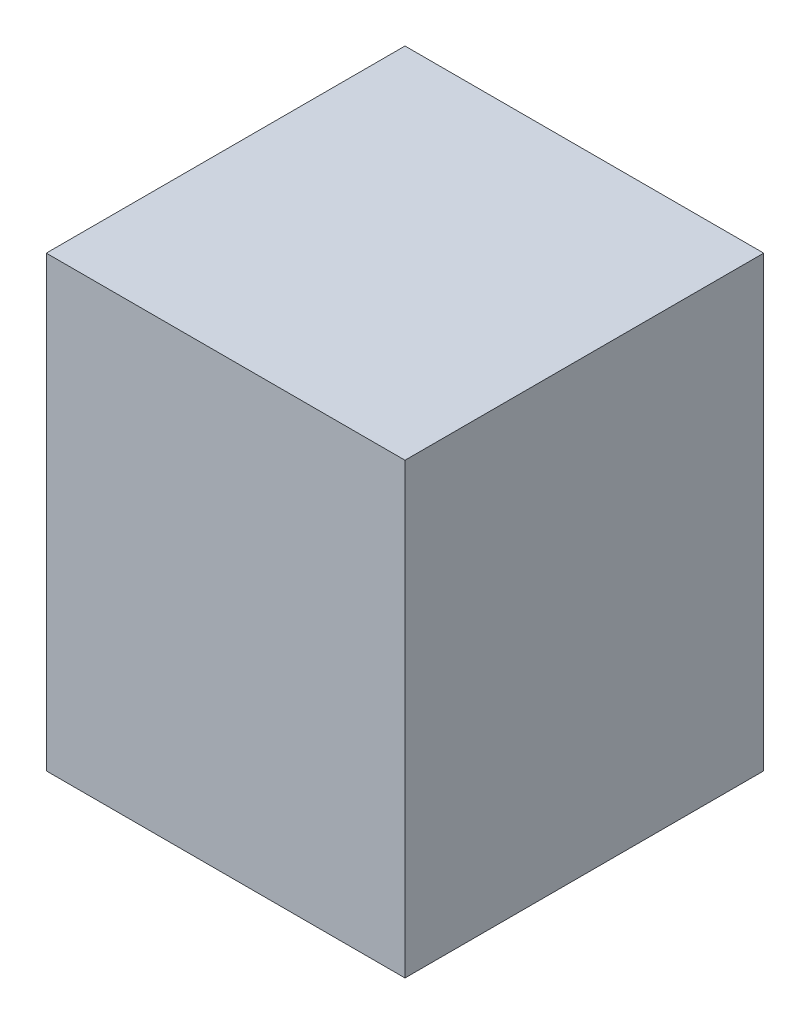
ISO-10303-21;
HEADER;
FILE_DESCRIPTION(('STEP AP214'),'2;1');
FILE_NAME('part.step','',(''),(''),'','','');
FILE_SCHEMA(('AUTOMOTIVE_DESIGN { 1 0 10303 214 1 1 1 1 }'));
ENDSEC;
DATA;
#1=APPLICATION_CONTEXT('core data for automotive mechanical design processes');
#2=APPLICATION_PROTOCOL_DEFINITION('international standard','automotive_design',2000,#1);
#3=PRODUCT_CONTEXT('',#1,'mechanical');
#4=PRODUCT('Part','Part','',(#3));
#5=PRODUCT_RELATED_PRODUCT_CATEGORY('part','',(#4));
#6=PRODUCT_DEFINITION_FORMATION('','',#4);
#7=PRODUCT_DEFINITION_CONTEXT('part definition',#1,'design');
#8=PRODUCT_DEFINITION('design','',#6,#7);
#9=PRODUCT_DEFINITION_SHAPE('','',#8);
#10=(LENGTH_UNIT() NAMED_UNIT(*) SI_UNIT(.MILLI.,.METRE.));
#11=(NAMED_UNIT(*) PLANE_ANGLE_UNIT() SI_UNIT($,.RADIAN.));
#12=(NAMED_UNIT(*) SI_UNIT($,.STERADIAN.) SOLID_ANGLE_UNIT());
#13=UNCERTAINTY_MEASURE_WITH_UNIT(LENGTH_MEASURE(1.E-05),#10,'distance_accuracy_value','');
#14=(GEOMETRIC_REPRESENTATION_CONTEXT(3) GLOBAL_UNCERTAINTY_ASSIGNED_CONTEXT((#13)) GLOBAL_UNIT_ASSIGNED_CONTEXT((#10,
#11,#12)) REPRESENTATION_CONTEXT('',''));
#15=CARTESIAN_POINT('',(0.,0.,0.));
#16=DIRECTION('',(0.,0.,1.));
#17=DIRECTION('',(1.,0.,0.));
#18=AXIS2_PLACEMENT_3D('',#15,#16,#17);
#19=CARTESIAN_POINT('',(0.,5.,4.));
#20=DIRECTION('',(1.,0.,0.));
#21=DIRECTION('',(0.,0.,-1.));
#22=AXIS2_PLACEMENT_3D('',#19,#20,#21);
#23=PLANE('',#22);
#24=DIRECTION('',(0.,-1.,0.));
#25=VECTOR('',#24,1.);
#26=CARTESIAN_POINT('',(0.,5.,0.));
#27=LINE('',#26,#25);
#28=CARTESIAN_POINT('',(0.,5.,0.));
#29=VERTEX_POINT('',#28);
#30=CARTESIAN_POINT('',(0.,0.,0.));
#31=VERTEX_POINT('',#30);
#32=EDGE_CURVE('E97',#29,#31,#27,.T.);
#33=ORIENTED_EDGE('',*,*,#32,.T.);
#34=DIRECTION('',(0.,0.,-1.));
#35=VECTOR('',#34,1.);
#36=CARTESIAN_POINT('',(0.,0.,4.));
#37=LINE('',#36,#35);
#38=CARTESIAN_POINT('',(0.,0.,4.));
#39=VERTEX_POINT('',#38);
#40=EDGE_CURVE('E11',#39,#31,#37,.T.);
#41=ORIENTED_EDGE('',*,*,#40,.F.);
#42=DIRECTION('',(0.,-1.,0.));
#43=VECTOR('',#42,1.);
#44=CARTESIAN_POINT('',(0.,5.,4.));
#45=LINE('',#44,#43);
#46=CARTESIAN_POINT('',(0.,5.,4.));
#47=VERTEX_POINT('',#46);
#48=EDGE_CURVE('E85',#47,#39,#45,.T.);
#49=ORIENTED_EDGE('',*,*,#48,.F.);
#50=DIRECTION('',(0.,0.,-1.));
#51=VECTOR('',#50,1.);
#52=CARTESIAN_POINT('',(0.,5.,4.));
#53=LINE('',#52,#51);
#54=EDGE_CURVE('E93',#47,#29,#53,.T.);
#55=ORIENTED_EDGE('',*,*,#54,.T.);
#56=EDGE_LOOP('',(#33,#41,#49,#55));
#57=FACE_BOUND('',#56,.T.);
#58=ADVANCED_FACE('F34',(#57),#23,.F.);
#59=CARTESIAN_POINT('',(0.,0.,4.));
#60=DIRECTION('',(0.,1.,0.));
#61=DIRECTION('',(0.,0.,1.));
#62=AXIS2_PLACEMENT_3D('',#59,#60,#61);
#63=PLANE('',#62);
#64=DIRECTION('',(1.,0.,0.));
#65=VECTOR('',#64,1.);
#66=CARTESIAN_POINT('',(0.,0.,0.));
#67=LINE('',#66,#65);
#68=CARTESIAN_POINT('',(4.,0.,0.));
#69=VERTEX_POINT('',#68);
#70=EDGE_CURVE('E89',#31,#69,#67,.T.);
#71=ORIENTED_EDGE('',*,*,#70,.T.);
#72=DIRECTION('',(0.,0.,-1.));
#73=VECTOR('',#72,1.);
#74=CARTESIAN_POINT('',(4.,0.,4.));
#75=LINE('',#74,#73);
#76=CARTESIAN_POINT('',(4.,0.,4.));
#77=VERTEX_POINT('',#76);
#78=EDGE_CURVE('E42',#77,#69,#75,.T.);
#79=ORIENTED_EDGE('',*,*,#78,.F.);
#80=DIRECTION('',(1.,0.,0.));
#81=VECTOR('',#80,1.);
#82=CARTESIAN_POINT('',(0.,0.,4.));
#83=LINE('',#82,#81);
#84=EDGE_CURVE('E80',#39,#77,#83,.T.);
#85=ORIENTED_EDGE('',*,*,#84,.F.);
#86=ORIENTED_EDGE('',*,*,#40,.T.);
#87=EDGE_LOOP('',(#71,#79,#85,#86));
#88=FACE_BOUND('',#87,.T.);
#89=ADVANCED_FACE('F88',(#88),#63,.F.);
#90=CARTESIAN_POINT('',(4.,0.,4.));
#91=DIRECTION('',(-1.,0.,0.));
#92=DIRECTION('',(0.,0.,1.));
#93=AXIS2_PLACEMENT_3D('',#90,#91,#92);
#94=PLANE('',#93);
#95=DIRECTION('',(0.,1.,0.));
#96=VECTOR('',#95,1.);
#97=CARTESIAN_POINT('',(4.,0.,0.));
#98=LINE('',#97,#96);
#99=CARTESIAN_POINT('',(4.,5.,0.));
#100=VERTEX_POINT('',#99);
#101=EDGE_CURVE('E67',#69,#100,#98,.T.);
#102=ORIENTED_EDGE('',*,*,#101,.T.);
#103=DIRECTION('',(0.,0.,-1.));
#104=VECTOR('',#103,1.);
#105=CARTESIAN_POINT('',(4.,5.,4.));
#106=LINE('',#105,#104);
#107=CARTESIAN_POINT('',(4.,5.,4.));
#108=VERTEX_POINT('',#107);
#109=EDGE_CURVE('E90',#108,#100,#106,.T.);
#110=ORIENTED_EDGE('',*,*,#109,.F.);
#111=DIRECTION('',(0.,1.,0.));
#112=VECTOR('',#111,1.);
#113=CARTESIAN_POINT('',(4.,0.,4.));
#114=LINE('',#113,#112);
#115=EDGE_CURVE('E83',#77,#108,#114,.T.);
#116=ORIENTED_EDGE('',*,*,#115,.F.);
#117=ORIENTED_EDGE('',*,*,#78,.T.);
#118=EDGE_LOOP('',(#102,#110,#116,#117));
#119=FACE_BOUND('',#118,.T.);
#120=ADVANCED_FACE('F91',(#119),#94,.F.);
#121=CARTESIAN_POINT('',(4.,5.,4.));
#122=DIRECTION('',(0.,-1.,0.));
#123=DIRECTION('',(0.,0.,-1.));
#124=AXIS2_PLACEMENT_3D('',#121,#122,#123);
#125=PLANE('',#124);
#126=DIRECTION('',(-1.,0.,0.));
#127=VECTOR('',#126,1.);
#128=CARTESIAN_POINT('',(4.,5.,0.));
#129=LINE('',#128,#127);
#130=EDGE_CURVE('E73',#100,#29,#129,.T.);
#131=ORIENTED_EDGE('',*,*,#130,.T.);
#132=ORIENTED_EDGE('',*,*,#54,.F.);
#133=DIRECTION('',(-1.,0.,0.));
#134=VECTOR('',#133,1.);
#135=CARTESIAN_POINT('',(4.,5.,4.));
#136=LINE('',#135,#134);
#137=EDGE_CURVE('E50',#108,#47,#136,.T.);
#138=ORIENTED_EDGE('',*,*,#137,.F.);
#139=ORIENTED_EDGE('',*,*,#109,.T.);
#140=EDGE_LOOP('',(#131,#132,#138,#139));
#141=FACE_BOUND('',#140,.T.);
#142=ADVANCED_FACE('F104',(#141),#125,.F.);
#143=CARTESIAN_POINT('',(0.,0.,4.));
#144=DIRECTION('',(0.,0.,1.));
#145=DIRECTION('',(1.,0.,0.));
#146=AXIS2_PLACEMENT_3D('',#143,#144,#145);
#147=PLANE('',#146);
#148=ORIENTED_EDGE('',*,*,#48,.T.);
#149=ORIENTED_EDGE('',*,*,#84,.T.);
#150=ORIENTED_EDGE('',*,*,#115,.T.);
#151=ORIENTED_EDGE('',*,*,#137,.T.);
#152=EDGE_LOOP('',(#148,#149,#150,#151));
#153=FACE_BOUND('',#152,.T.);
#154=ADVANCED_FACE('F81',(#153),#147,.T.);
#155=CARTESIAN_POINT('',(0.,0.,0.));
#156=DIRECTION('',(0.,0.,1.));
#157=DIRECTION('',(1.,0.,0.));
#158=AXIS2_PLACEMENT_3D('',#155,#156,#157);
#159=PLANE('',#158);
#160=ORIENTED_EDGE('',*,*,#32,.F.);
#161=ORIENTED_EDGE('',*,*,#130,.F.);
#162=ORIENTED_EDGE('',*,*,#101,.F.);
#163=ORIENTED_EDGE('',*,*,#70,.F.);
#164=EDGE_LOOP('',(#160,#161,#162,#163));
#165=FACE_BOUND('',#164,.T.);
#166=ADVANCED_FACE('F107',(#165),#159,.F.);
#167=CLOSED_SHELL('',(#58,#89,#120,#142,#154,#166));
#168=MANIFOLD_SOLID_BREP('B2',#167);
#169=ADVANCED_BREP_SHAPE_REPRESENTATION('',(#18,#168),#14);
#170=SHAPE_DEFINITION_REPRESENTATION(#9,#169);
ENDSEC;
END-ISO-10303-21;
